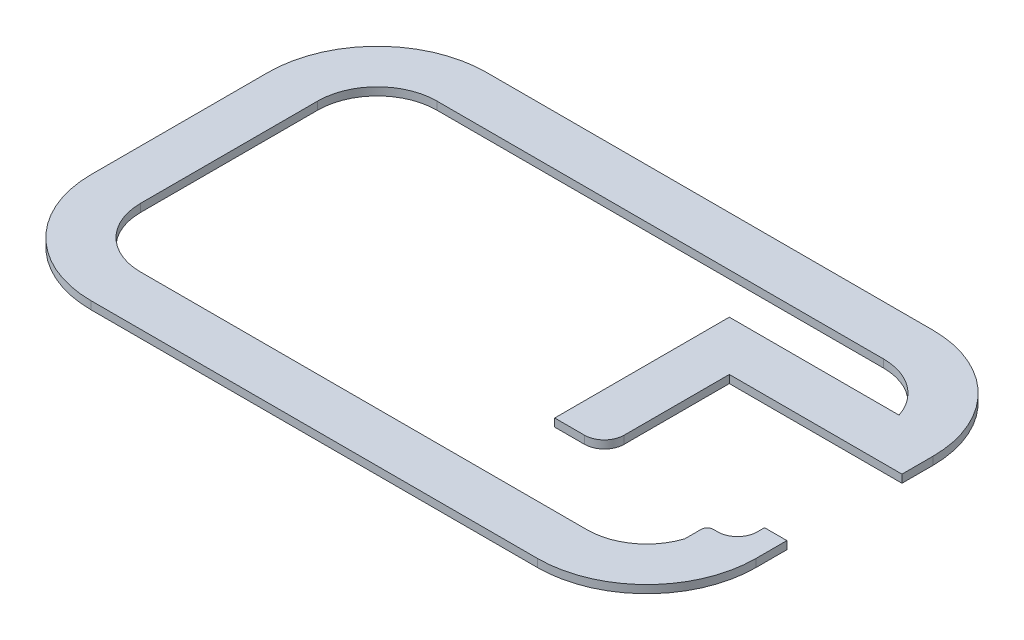
ISO-10303-21;
HEADER;
FILE_DESCRIPTION(('STEP AP214'),'2;1');
FILE_NAME('part.step','',(''),(''),'','','');
FILE_SCHEMA(('AUTOMOTIVE_DESIGN { 1 0 10303 214 1 1 1 1 }'));
ENDSEC;
DATA;
#1=APPLICATION_CONTEXT('core data for automotive mechanical design processes');
#2=APPLICATION_PROTOCOL_DEFINITION('international standard','automotive_design',2000,#1);
#3=PRODUCT_CONTEXT('',#1,'mechanical');
#4=PRODUCT('Part','Part','',(#3));
#5=PRODUCT_RELATED_PRODUCT_CATEGORY('part','',(#4));
#6=PRODUCT_DEFINITION_FORMATION('','',#4);
#7=PRODUCT_DEFINITION_CONTEXT('part definition',#1,'design');
#8=PRODUCT_DEFINITION('design','',#6,#7);
#9=PRODUCT_DEFINITION_SHAPE('','',#8);
#10=(LENGTH_UNIT() NAMED_UNIT(*) SI_UNIT(.MILLI.,.METRE.));
#11=(NAMED_UNIT(*) PLANE_ANGLE_UNIT() SI_UNIT($,.RADIAN.));
#12=(NAMED_UNIT(*) SI_UNIT($,.STERADIAN.) SOLID_ANGLE_UNIT());
#13=UNCERTAINTY_MEASURE_WITH_UNIT(LENGTH_MEASURE(1.E-05),#10,'distance_accuracy_value','');
#14=(GEOMETRIC_REPRESENTATION_CONTEXT(3) GLOBAL_UNCERTAINTY_ASSIGNED_CONTEXT((#13)) GLOBAL_UNIT_ASSIGNED_CONTEXT((#10,
#11,#12)) REPRESENTATION_CONTEXT('',''));
#15=CARTESIAN_POINT('',(0.,0.,0.));
#16=DIRECTION('',(0.,0.,1.));
#17=DIRECTION('',(1.,0.,0.));
#18=AXIS2_PLACEMENT_3D('',#15,#16,#17);
#19=CARTESIAN_POINT('',(5.26569899803327,4.,26.8294641926129));
#20=DIRECTION('',(0.,-1.,0.));
#21=DIRECTION('',(0.,0.,-1.));
#22=AXIS2_PLACEMENT_3D('',#19,#20,#21);
#23=CYLINDRICAL_SURFACE('',#22,55.);
#24=CARTESIAN_POINT('',(5.26569899803327,0.,26.8294641926129));
#25=DIRECTION('',(0.,1.,0.));
#26=DIRECTION('',(0.,0.,1.));
#27=AXIS2_PLACEMENT_3D('',#24,#25,#26);
#28=CIRCLE('',#27,55.);
#29=CARTESIAN_POINT('',(5.26569899803365,0.,-28.1705358073871));
#30=VERTEX_POINT('',#29);
#31=CARTESIAN_POINT('',(-49.7343010019667,0.,26.8294641926133));
#32=VERTEX_POINT('',#31);
#33=EDGE_CURVE('E248',#30,#32,#28,.T.);
#34=ORIENTED_EDGE('',*,*,#33,.T.);
#35=DIRECTION('',(0.,-1.,0.));
#36=VECTOR('',#35,1.);
#37=CARTESIAN_POINT('',(-49.7343010019667,4.,26.8294641926133));
#38=LINE('',#37,#36);
#39=CARTESIAN_POINT('',(-49.7343010019667,4.,26.8294641926133));
#40=VERTEX_POINT('',#39);
#41=EDGE_CURVE('E11',#40,#32,#38,.T.);
#42=ORIENTED_EDGE('',*,*,#41,.F.);
#43=CARTESIAN_POINT('',(5.26569899803327,4.,26.8294641926129));
#44=DIRECTION('',(0.,1.,0.));
#45=DIRECTION('',(0.,0.,1.));
#46=AXIS2_PLACEMENT_3D('',#43,#44,#45);
#47=CIRCLE('',#46,55.);
#48=CARTESIAN_POINT('',(5.26569899803365,4.,-28.1705358073871));
#49=VERTEX_POINT('',#48);
#50=EDGE_CURVE('E302',#49,#40,#47,.T.);
#51=ORIENTED_EDGE('',*,*,#50,.F.);
#52=DIRECTION('',(0.,-1.,0.));
#53=VECTOR('',#52,1.);
#54=CARTESIAN_POINT('',(5.26569899803365,4.,-28.1705358073871));
#55=LINE('',#54,#53);
#56=EDGE_CURVE('E244',#49,#30,#55,.T.);
#57=ORIENTED_EDGE('',*,*,#56,.T.);
#58=EDGE_LOOP('',(#34,#42,#51,#57));
#59=FACE_BOUND('',#58,.T.);
#60=ADVANCED_FACE('F32',(#59),#23,.T.);
#61=CARTESIAN_POINT('',(-49.7343010019667,4.,26.8294641926133));
#62=DIRECTION('',(1.,0.,0.));
#63=DIRECTION('',(0.,0.,-1.));
#64=AXIS2_PLACEMENT_3D('',#61,#62,#63);
#65=PLANE('',#64);
#66=DIRECTION('',(0.,0.,1.));
#67=VECTOR('',#66,1.);
#68=CARTESIAN_POINT('',(-49.7343010019667,0.,26.8294641926133));
#69=LINE('',#68,#67);
#70=CARTESIAN_POINT('',(-49.7343010019667,0.,116.089464192613));
#71=VERTEX_POINT('',#70);
#72=EDGE_CURVE('E251',#32,#71,#69,.T.);
#73=ORIENTED_EDGE('',*,*,#72,.T.);
#74=DIRECTION('',(0.,-1.,0.));
#75=VECTOR('',#74,1.);
#76=CARTESIAN_POINT('',(-49.7343010019667,4.,116.089464192613));
#77=LINE('',#76,#75);
#78=CARTESIAN_POINT('',(-49.7343010019667,4.,116.089464192613));
#79=VERTEX_POINT('',#78);
#80=EDGE_CURVE('E40',#79,#71,#77,.T.);
#81=ORIENTED_EDGE('',*,*,#80,.F.);
#82=DIRECTION('',(0.,0.,1.));
#83=VECTOR('',#82,1.);
#84=CARTESIAN_POINT('',(-49.7343010019667,4.,26.8294641926133));
#85=LINE('',#84,#83);
#86=EDGE_CURVE('E151',#40,#79,#85,.T.);
#87=ORIENTED_EDGE('',*,*,#86,.F.);
#88=ORIENTED_EDGE('',*,*,#41,.T.);
#89=EDGE_LOOP('',(#73,#81,#87,#88));
#90=FACE_BOUND('',#89,.T.);
#91=ADVANCED_FACE('F460',(#90),#65,.F.);
#92=CARTESIAN_POINT('',(5.26569899803329,4.,116.089464192613));
#93=DIRECTION('',(0.,-1.,0.));
#94=DIRECTION('',(0.,0.,-1.));
#95=AXIS2_PLACEMENT_3D('',#92,#93,#94);
#96=CYLINDRICAL_SURFACE('',#95,55.);
#97=CARTESIAN_POINT('',(5.26569899803329,0.,116.089464192613));
#98=DIRECTION('',(0.,1.,0.));
#99=DIRECTION('',(0.,0.,1.));
#100=AXIS2_PLACEMENT_3D('',#97,#98,#99);
#101=CIRCLE('',#100,55.);
#102=CARTESIAN_POINT('',(5.26569899803368,0.,171.089464192613));
#103=VERTEX_POINT('',#102);
#104=EDGE_CURVE('E253',#71,#103,#101,.T.);
#105=ORIENTED_EDGE('',*,*,#104,.T.);
#106=DIRECTION('',(0.,-1.,0.));
#107=VECTOR('',#106,1.);
#108=CARTESIAN_POINT('',(5.26569899803368,4.,171.089464192613));
#109=LINE('',#108,#107);
#110=CARTESIAN_POINT('',(5.26569899803368,4.,171.089464192613));
#111=VERTEX_POINT('',#110);
#112=EDGE_CURVE('E369',#111,#103,#109,.T.);
#113=ORIENTED_EDGE('',*,*,#112,.F.);
#114=CARTESIAN_POINT('',(5.26569899803329,4.,116.089464192613));
#115=DIRECTION('',(0.,1.,0.));
#116=DIRECTION('',(0.,0.,1.));
#117=AXIS2_PLACEMENT_3D('',#114,#115,#116);
#118=CIRCLE('',#117,55.);
#119=EDGE_CURVE('E377',#79,#111,#118,.T.);
#120=ORIENTED_EDGE('',*,*,#119,.F.);
#121=ORIENTED_EDGE('',*,*,#80,.T.);
#122=EDGE_LOOP('',(#105,#113,#120,#121));
#123=FACE_BOUND('',#122,.T.);
#124=ADVANCED_FACE('F375',(#123),#96,.T.);
#125=CARTESIAN_POINT('',(5.26569899803368,4.,171.089464192613));
#126=DIRECTION('',(0.,0.,-1.));
#127=DIRECTION('',(-1.,0.,0.));
#128=AXIS2_PLACEMENT_3D('',#125,#126,#127);
#129=PLANE('',#128);
#130=DIRECTION('',(1.,0.,0.));
#131=VECTOR('',#130,1.);
#132=CARTESIAN_POINT('',(5.26569899803368,0.,171.089464192613));
#133=LINE('',#132,#131);
#134=CARTESIAN_POINT('',(230.295698998033,0.,171.089464192613));
#135=VERTEX_POINT('',#134);
#136=EDGE_CURVE('E255',#103,#135,#133,.T.);
#137=ORIENTED_EDGE('',*,*,#136,.T.);
#138=DIRECTION('',(0.,-1.,0.));
#139=VECTOR('',#138,1.);
#140=CARTESIAN_POINT('',(230.295698998033,4.,171.089464192613));
#141=LINE('',#140,#139);
#142=CARTESIAN_POINT('',(230.295698998033,4.,171.089464192613));
#143=VERTEX_POINT('',#142);
#144=EDGE_CURVE('E366',#143,#135,#141,.T.);
#145=ORIENTED_EDGE('',*,*,#144,.F.);
#146=DIRECTION('',(1.,0.,0.));
#147=VECTOR('',#146,1.);
#148=CARTESIAN_POINT('',(5.26569899803368,4.,171.089464192613));
#149=LINE('',#148,#147);
#150=EDGE_CURVE('E395',#111,#143,#149,.T.);
#151=ORIENTED_EDGE('',*,*,#150,.F.);
#152=ORIENTED_EDGE('',*,*,#112,.T.);
#153=EDGE_LOOP('',(#137,#145,#151,#152));
#154=FACE_BOUND('',#153,.T.);
#155=ADVANCED_FACE('F386',(#154),#129,.F.);
#156=CARTESIAN_POINT('',(230.295698998033,4.,116.089464192613));
#157=DIRECTION('',(0.,-1.,0.));
#158=DIRECTION('',(0.,0.,-1.));
#159=AXIS2_PLACEMENT_3D('',#156,#157,#158);
#160=CYLINDRICAL_SURFACE('',#159,55.);
#161=CARTESIAN_POINT('',(230.295698998033,0.,116.089464192613));
#162=DIRECTION('',(0.,1.,0.));
#163=DIRECTION('',(0.,0.,1.));
#164=AXIS2_PLACEMENT_3D('',#161,#162,#163);
#165=CIRCLE('',#164,55.);
#166=CARTESIAN_POINT('',(285.295698998033,0.,116.089464192613));
#167=VERTEX_POINT('',#166);
#168=EDGE_CURVE('E257',#135,#167,#165,.T.);
#169=ORIENTED_EDGE('',*,*,#168,.T.);
#170=DIRECTION('',(0.,-1.,0.));
#171=VECTOR('',#170,1.);
#172=CARTESIAN_POINT('',(285.295698998033,4.,116.089464192613));
#173=LINE('',#172,#171);
#174=CARTESIAN_POINT('',(285.295698998033,4.,116.089464192613));
#175=VERTEX_POINT('',#174);
#176=EDGE_CURVE('E363',#175,#167,#173,.T.);
#177=ORIENTED_EDGE('',*,*,#176,.F.);
#178=CARTESIAN_POINT('',(230.295698998033,4.,116.089464192613));
#179=DIRECTION('',(0.,1.,0.));
#180=DIRECTION('',(0.,0.,1.));
#181=AXIS2_PLACEMENT_3D('',#178,#179,#180);
#182=CIRCLE('',#181,55.);
#183=EDGE_CURVE('E392',#143,#175,#182,.T.);
#184=ORIENTED_EDGE('',*,*,#183,.F.);
#185=ORIENTED_EDGE('',*,*,#144,.T.);
#186=EDGE_LOOP('',(#169,#177,#184,#185));
#187=FACE_BOUND('',#186,.T.);
#188=ADVANCED_FACE('F390',(#187),#160,.T.);
#189=CARTESIAN_POINT('',(285.295698998033,4.,100.459464192613));
#190=DIRECTION('',(-1.,0.,0.));
#191=DIRECTION('',(0.,0.,1.));
#192=AXIS2_PLACEMENT_3D('',#189,#190,#191);
#193=PLANE('',#192);
#194=DIRECTION('',(0.,0.,-1.));
#195=VECTOR('',#194,1.);
#196=CARTESIAN_POINT('',(285.295698998033,0.,100.459464192613));
#197=LINE('',#196,#195);
#198=CARTESIAN_POINT('',(285.295698998033,0.,100.459464192613));
#199=VERTEX_POINT('',#198);
#200=EDGE_CURVE('E259',#167,#199,#197,.T.);
#201=ORIENTED_EDGE('',*,*,#200,.T.);
#202=DIRECTION('',(0.,-1.,0.));
#203=VECTOR('',#202,1.);
#204=CARTESIAN_POINT('',(285.295698998033,4.,100.459464192613));
#205=LINE('',#204,#203);
#206=CARTESIAN_POINT('',(285.295698998033,4.,100.459464192613));
#207=VERTEX_POINT('',#206);
#208=EDGE_CURVE('E360',#207,#199,#205,.T.);
#209=ORIENTED_EDGE('',*,*,#208,.F.);
#210=DIRECTION('',(0.,0.,-1.));
#211=VECTOR('',#210,1.);
#212=CARTESIAN_POINT('',(285.295698998033,4.,100.459464192613));
#213=LINE('',#212,#211);
#214=EDGE_CURVE('E394',#175,#207,#213,.T.);
#215=ORIENTED_EDGE('',*,*,#214,.F.);
#216=ORIENTED_EDGE('',*,*,#176,.T.);
#217=EDGE_LOOP('',(#201,#209,#215,#216));
#218=FACE_BOUND('',#217,.T.);
#219=ADVANCED_FACE('F473',(#218),#193,.F.);
#220=CARTESIAN_POINT('',(274.045287588586,4.,100.459464192613));
#221=DIRECTION('',(0.,0.,1.));
#222=DIRECTION('',(1.,0.,0.));
#223=AXIS2_PLACEMENT_3D('',#220,#221,#222);
#224=PLANE('',#223);
#225=DIRECTION('',(-1.,0.,0.));
#226=VECTOR('',#225,1.);
#227=CARTESIAN_POINT('',(274.045287588586,0.,100.459464192613));
#228=LINE('',#227,#226);
#229=CARTESIAN_POINT('',(274.045287588586,0.,100.459464192613));
#230=VERTEX_POINT('',#229);
#231=EDGE_CURVE('E261',#199,#230,#228,.T.);
#232=ORIENTED_EDGE('',*,*,#231,.T.);
#233=DIRECTION('',(0.,-1.,0.));
#234=VECTOR('',#233,1.);
#235=CARTESIAN_POINT('',(274.045287588586,4.,100.459464192613));
#236=LINE('',#235,#234);
#237=CARTESIAN_POINT('',(274.045287588586,4.,100.459464192613));
#238=VERTEX_POINT('',#237);
#239=EDGE_CURVE('E357',#238,#230,#236,.T.);
#240=ORIENTED_EDGE('',*,*,#239,.F.);
#241=DIRECTION('',(-1.,0.,0.));
#242=VECTOR('',#241,1.);
#243=CARTESIAN_POINT('',(274.045287588586,4.,100.459464192613));
#244=LINE('',#243,#242);
#245=EDGE_CURVE('E397',#207,#238,#244,.T.);
#246=ORIENTED_EDGE('',*,*,#245,.F.);
#247=ORIENTED_EDGE('',*,*,#208,.T.);
#248=EDGE_LOOP('',(#232,#240,#246,#247));
#249=FACE_BOUND('',#248,.T.);
#250=ADVANCED_FACE('F476',(#249),#224,.F.);
#251=CARTESIAN_POINT('',(274.045287588586,4.,100.459464192613));
#252=DIRECTION('',(1.,0.,0.));
#253=DIRECTION('',(0.,0.,-1.));
#254=AXIS2_PLACEMENT_3D('',#251,#252,#253);
#255=PLANE('',#254);
#256=DIRECTION('',(0.,0.,1.));
#257=VECTOR('',#256,1.);
#258=CARTESIAN_POINT('',(274.045287588586,0.,100.459464192613));
#259=LINE('',#258,#257);
#260=CARTESIAN_POINT('',(274.045287588586,0.,104.089464192613));
#261=VERTEX_POINT('',#260);
#262=EDGE_CURVE('E263',#230,#261,#259,.T.);
#263=ORIENTED_EDGE('',*,*,#262,.T.);
#264=DIRECTION('',(0.,-1.,0.));
#265=VECTOR('',#264,1.);
#266=CARTESIAN_POINT('',(274.045287588586,4.,104.089464192613));
#267=LINE('',#266,#265);
#268=CARTESIAN_POINT('',(274.045287588586,4.,104.089464192613));
#269=VERTEX_POINT('',#268);
#270=EDGE_CURVE('E354',#269,#261,#267,.T.);
#271=ORIENTED_EDGE('',*,*,#270,.F.);
#272=DIRECTION('',(0.,0.,1.));
#273=VECTOR('',#272,1.);
#274=CARTESIAN_POINT('',(274.045287588586,4.,100.459464192613));
#275=LINE('',#274,#273);
#276=EDGE_CURVE('E403',#238,#269,#275,.T.);
#277=ORIENTED_EDGE('',*,*,#276,.F.);
#278=ORIENTED_EDGE('',*,*,#239,.T.);
#279=EDGE_LOOP('',(#263,#271,#277,#278));
#280=FACE_BOUND('',#279,.T.);
#281=ADVANCED_FACE('F480',(#280),#255,.F.);
#282=CARTESIAN_POINT('',(264.045287588586,4.,104.089464192613));
#283=DIRECTION('',(0.,-1.,0.));
#284=DIRECTION('',(0.,0.,-1.));
#285=AXIS2_PLACEMENT_3D('',#282,#283,#284);
#286=CYLINDRICAL_SURFACE('',#285,10.);
#287=CARTESIAN_POINT('',(264.045287588586,0.,104.089464192613));
#288=DIRECTION('',(0.,-1.,0.));
#289=DIRECTION('',(0.,0.,-1.));
#290=AXIS2_PLACEMENT_3D('',#287,#288,#289);
#291=CIRCLE('',#290,10.);
#292=CARTESIAN_POINT('',(264.045287588586,0.,114.089464192613));
#293=VERTEX_POINT('',#292);
#294=EDGE_CURVE('E265',#261,#293,#291,.T.);
#295=ORIENTED_EDGE('',*,*,#294,.T.);
#296=DIRECTION('',(0.,-1.,0.));
#297=VECTOR('',#296,1.);
#298=CARTESIAN_POINT('',(264.045287588586,4.,114.089464192613));
#299=LINE('',#298,#297);
#300=CARTESIAN_POINT('',(264.045287588586,4.,114.089464192613));
#301=VERTEX_POINT('',#300);
#302=EDGE_CURVE('E351',#301,#293,#299,.T.);
#303=ORIENTED_EDGE('',*,*,#302,.F.);
#304=CARTESIAN_POINT('',(264.045287588586,4.,104.089464192613));
#305=DIRECTION('',(0.,-1.,0.));
#306=DIRECTION('',(0.,0.,-1.));
#307=AXIS2_PLACEMENT_3D('',#304,#305,#306);
#308=CIRCLE('',#307,10.);
#309=EDGE_CURVE('E405',#269,#301,#308,.T.);
#310=ORIENTED_EDGE('',*,*,#309,.F.);
#311=ORIENTED_EDGE('',*,*,#270,.T.);
#312=EDGE_LOOP('',(#295,#303,#310,#311));
#313=FACE_BOUND('',#312,.T.);
#314=ADVANCED_FACE('F484',(#313),#286,.F.);
#315=CARTESIAN_POINT('',(264.045287588586,4.,114.089464192613));
#316=DIRECTION('',(0.,0.,1.));
#317=DIRECTION('',(1.,0.,0.));
#318=AXIS2_PLACEMENT_3D('',#315,#316,#317);
#319=PLANE('',#318);
#320=DIRECTION('',(-1.,0.,0.));
#321=VECTOR('',#320,1.);
#322=CARTESIAN_POINT('',(264.045287588586,0.,114.089464192613));
#323=LINE('',#322,#321);
#324=CARTESIAN_POINT('',(261.794876179138,0.,114.089464192613));
#325=VERTEX_POINT('',#324);
#326=EDGE_CURVE('E267',#293,#325,#323,.T.);
#327=ORIENTED_EDGE('',*,*,#326,.T.);
#328=DIRECTION('',(0.,-1.,0.));
#329=VECTOR('',#328,1.);
#330=CARTESIAN_POINT('',(261.794876179138,4.,114.089464192613));
#331=LINE('',#330,#329);
#332=CARTESIAN_POINT('',(261.794876179138,4.,114.089464192613));
#333=VERTEX_POINT('',#332);
#334=EDGE_CURVE('E348',#333,#325,#331,.T.);
#335=ORIENTED_EDGE('',*,*,#334,.F.);
#336=DIRECTION('',(-1.,0.,0.));
#337=VECTOR('',#336,1.);
#338=CARTESIAN_POINT('',(264.045287588586,4.,114.089464192613));
#339=LINE('',#338,#337);
#340=EDGE_CURVE('E407',#301,#333,#339,.T.);
#341=ORIENTED_EDGE('',*,*,#340,.F.);
#342=ORIENTED_EDGE('',*,*,#302,.T.);
#343=EDGE_LOOP('',(#327,#335,#341,#342));
#344=FACE_BOUND('',#343,.T.);
#345=ADVANCED_FACE('F488',(#344),#319,.F.);
#346=CARTESIAN_POINT('',(261.794876179138,4.,117.089464192613));
#347=DIRECTION('',(0.,-1.,0.));
#348=DIRECTION('',(0.,0.,-1.));
#349=AXIS2_PLACEMENT_3D('',#346,#347,#348);
#350=CYLINDRICAL_SURFACE('',#349,3.);
#351=CARTESIAN_POINT('',(261.794876179138,0.,117.089464192613));
#352=DIRECTION('',(0.,1.,0.));
#353=DIRECTION('',(0.,0.,1.));
#354=AXIS2_PLACEMENT_3D('',#351,#352,#353);
#355=CIRCLE('',#354,3.);
#356=CARTESIAN_POINT('',(258.794876179138,0.,117.089464192613));
#357=VERTEX_POINT('',#356);
#358=EDGE_CURVE('E269',#325,#357,#355,.T.);
#359=ORIENTED_EDGE('',*,*,#358,.T.);
#360=DIRECTION('',(0.,-1.,0.));
#361=VECTOR('',#360,1.);
#362=CARTESIAN_POINT('',(258.794876179138,4.,117.089464192613));
#363=LINE('',#362,#361);
#364=CARTESIAN_POINT('',(258.794876179138,4.,117.089464192613));
#365=VERTEX_POINT('',#364);
#366=EDGE_CURVE('E345',#365,#357,#363,.T.);
#367=ORIENTED_EDGE('',*,*,#366,.F.);
#368=CARTESIAN_POINT('',(261.794876179138,4.,117.089464192613));
#369=DIRECTION('',(0.,1.,0.));
#370=DIRECTION('',(0.,0.,1.));
#371=AXIS2_PLACEMENT_3D('',#368,#369,#370);
#372=CIRCLE('',#371,3.);
#373=EDGE_CURVE('E409',#333,#365,#372,.T.);
#374=ORIENTED_EDGE('',*,*,#373,.F.);
#375=ORIENTED_EDGE('',*,*,#334,.T.);
#376=EDGE_LOOP('',(#359,#367,#374,#375));
#377=FACE_BOUND('',#376,.T.);
#378=ADVANCED_FACE('F492',(#377),#350,.T.);
#379=CARTESIAN_POINT('',(258.794876179138,4.,125.459464192613));
#380=DIRECTION('',(1.,0.,0.));
#381=DIRECTION('',(0.,0.,-1.));
#382=AXIS2_PLACEMENT_3D('',#379,#380,#381);
#383=PLANE('',#382);
#384=DIRECTION('',(0.,0.,1.));
#385=VECTOR('',#384,1.);
#386=CARTESIAN_POINT('',(258.794876179138,0.,125.459464192613));
#387=LINE('',#386,#385);
#388=CARTESIAN_POINT('',(258.794876179138,0.,125.459464192613));
#389=VERTEX_POINT('',#388);
#390=EDGE_CURVE('E271',#357,#389,#387,.T.);
#391=ORIENTED_EDGE('',*,*,#390,.T.);
#392=DIRECTION('',(0.,-1.,0.));
#393=VECTOR('',#392,1.);
#394=CARTESIAN_POINT('',(258.794876179138,4.,125.459464192613));
#395=LINE('',#394,#393);
#396=CARTESIAN_POINT('',(258.794876179138,4.,125.459464192613));
#397=VERTEX_POINT('',#396);
#398=EDGE_CURVE('E342',#397,#389,#395,.T.);
#399=ORIENTED_EDGE('',*,*,#398,.F.);
#400=DIRECTION('',(0.,0.,1.));
#401=VECTOR('',#400,1.);
#402=CARTESIAN_POINT('',(258.794876179138,4.,125.459464192613));
#403=LINE('',#402,#401);
#404=EDGE_CURVE('E411',#365,#397,#403,.T.);
#405=ORIENTED_EDGE('',*,*,#404,.F.);
#406=ORIENTED_EDGE('',*,*,#366,.T.);
#407=EDGE_LOOP('',(#391,#399,#405,#406));
#408=FACE_BOUND('',#407,.T.);
#409=ADVANCED_FACE('F496',(#408),#383,.F.);
#410=CARTESIAN_POINT('',(230.295698998033,4.,116.089464192613));
#411=DIRECTION('',(0.,-1.,0.));
#412=DIRECTION('',(0.,0.,-1.));
#413=AXIS2_PLACEMENT_3D('',#410,#411,#412);
#414=CYLINDRICAL_SURFACE('',#413,30.);
#415=CARTESIAN_POINT('',(230.295698998033,0.,116.089464192613));
#416=DIRECTION('',(0.,-1.,0.));
#417=DIRECTION('',(0.,0.,1.));
#418=AXIS2_PLACEMENT_3D('',#415,#416,#417);
#419=CIRCLE('',#418,30.);
#420=CARTESIAN_POINT('',(230.295698998033,0.,146.089464192613));
#421=VERTEX_POINT('',#420);
#422=EDGE_CURVE('E273',#389,#421,#419,.T.);
#423=ORIENTED_EDGE('',*,*,#422,.T.);
#424=DIRECTION('',(0.,-1.,0.));
#425=VECTOR('',#424,1.);
#426=CARTESIAN_POINT('',(230.295698998033,4.,146.089464192613));
#427=LINE('',#426,#425);
#428=CARTESIAN_POINT('',(230.295698998033,4.,146.089464192613));
#429=VERTEX_POINT('',#428);
#430=EDGE_CURVE('E339',#429,#421,#427,.T.);
#431=ORIENTED_EDGE('',*,*,#430,.F.);
#432=CARTESIAN_POINT('',(230.295698998033,4.,116.089464192613));
#433=DIRECTION('',(0.,-1.,0.));
#434=DIRECTION('',(0.,0.,1.));
#435=AXIS2_PLACEMENT_3D('',#432,#433,#434);
#436=CIRCLE('',#435,30.);
#437=EDGE_CURVE('E413',#397,#429,#436,.T.);
#438=ORIENTED_EDGE('',*,*,#437,.F.);
#439=ORIENTED_EDGE('',*,*,#398,.T.);
#440=EDGE_LOOP('',(#423,#431,#438,#439));
#441=FACE_BOUND('',#440,.T.);
#442=ADVANCED_FACE('F500',(#441),#414,.F.);
#443=CARTESIAN_POINT('',(5.26569899803368,4.,146.089464192613));
#444=DIRECTION('',(0.,0.,1.));
#445=DIRECTION('',(1.,0.,0.));
#446=AXIS2_PLACEMENT_3D('',#443,#444,#445);
#447=PLANE('',#446);
#448=DIRECTION('',(-1.,0.,0.));
#449=VECTOR('',#448,1.);
#450=CARTESIAN_POINT('',(5.26569899803368,0.,146.089464192613));
#451=LINE('',#450,#449);
#452=CARTESIAN_POINT('',(5.26569899803369,0.,146.089464192613));
#453=VERTEX_POINT('',#452);
#454=EDGE_CURVE('E275',#421,#453,#451,.T.);
#455=ORIENTED_EDGE('',*,*,#454,.T.);
#456=DIRECTION('',(0.,-1.,0.));
#457=VECTOR('',#456,1.);
#458=CARTESIAN_POINT('',(5.26569899803369,4.,146.089464192613));
#459=LINE('',#458,#457);
#460=CARTESIAN_POINT('',(5.26569899803369,4.,146.089464192613));
#461=VERTEX_POINT('',#460);
#462=EDGE_CURVE('E336',#461,#453,#459,.T.);
#463=ORIENTED_EDGE('',*,*,#462,.F.);
#464=DIRECTION('',(-1.,0.,0.));
#465=VECTOR('',#464,1.);
#466=CARTESIAN_POINT('',(5.26569899803368,4.,146.089464192613));
#467=LINE('',#466,#465);
#468=EDGE_CURVE('E415',#429,#461,#467,.T.);
#469=ORIENTED_EDGE('',*,*,#468,.F.);
#470=ORIENTED_EDGE('',*,*,#430,.T.);
#471=EDGE_LOOP('',(#455,#463,#469,#470));
#472=FACE_BOUND('',#471,.T.);
#473=ADVANCED_FACE('F504',(#472),#447,.F.);
#474=CARTESIAN_POINT('',(5.26569899803329,4.,116.089464192613));
#475=DIRECTION('',(0.,-1.,0.));
#476=DIRECTION('',(0.,0.,-1.));
#477=AXIS2_PLACEMENT_3D('',#474,#475,#476);
#478=CYLINDRICAL_SURFACE('',#477,30.);
#479=CARTESIAN_POINT('',(5.26569899803329,0.,116.089464192613));
#480=DIRECTION('',(0.,-1.,0.));
#481=DIRECTION('',(0.,0.,1.));
#482=AXIS2_PLACEMENT_3D('',#479,#480,#481);
#483=CIRCLE('',#482,30.);
#484=CARTESIAN_POINT('',(-24.7343010019667,0.,116.089464192613));
#485=VERTEX_POINT('',#484);
#486=EDGE_CURVE('E277',#453,#485,#483,.T.);
#487=ORIENTED_EDGE('',*,*,#486,.T.);
#488=DIRECTION('',(0.,-1.,0.));
#489=VECTOR('',#488,1.);
#490=CARTESIAN_POINT('',(-24.7343010019667,4.,116.089464192613));
#491=LINE('',#490,#489);
#492=CARTESIAN_POINT('',(-24.7343010019667,4.,116.089464192613));
#493=VERTEX_POINT('',#492);
#494=EDGE_CURVE('E333',#493,#485,#491,.T.);
#495=ORIENTED_EDGE('',*,*,#494,.F.);
#496=CARTESIAN_POINT('',(5.26569899803329,4.,116.089464192613));
#497=DIRECTION('',(0.,-1.,0.));
#498=DIRECTION('',(0.,0.,1.));
#499=AXIS2_PLACEMENT_3D('',#496,#497,#498);
#500=CIRCLE('',#499,30.);
#501=EDGE_CURVE('E417',#461,#493,#500,.T.);
#502=ORIENTED_EDGE('',*,*,#501,.F.);
#503=ORIENTED_EDGE('',*,*,#462,.T.);
#504=EDGE_LOOP('',(#487,#495,#502,#503));
#505=FACE_BOUND('',#504,.T.);
#506=ADVANCED_FACE('F508',(#505),#478,.F.);
#507=CARTESIAN_POINT('',(-24.7343010019667,4.,26.8294641926133));
#508=DIRECTION('',(-1.,0.,0.));
#509=DIRECTION('',(0.,0.,1.));
#510=AXIS2_PLACEMENT_3D('',#507,#508,#509);
#511=PLANE('',#510);
#512=DIRECTION('',(0.,0.,-1.));
#513=VECTOR('',#512,1.);
#514=CARTESIAN_POINT('',(-24.7343010019667,0.,26.8294641926133));
#515=LINE('',#514,#513);
#516=CARTESIAN_POINT('',(-24.7343010019667,0.,26.8294641926133));
#517=VERTEX_POINT('',#516);
#518=EDGE_CURVE('E279',#485,#517,#515,.T.);
#519=ORIENTED_EDGE('',*,*,#518,.T.);
#520=DIRECTION('',(0.,-1.,0.));
#521=VECTOR('',#520,1.);
#522=CARTESIAN_POINT('',(-24.7343010019667,4.,26.8294641926133));
#523=LINE('',#522,#521);
#524=CARTESIAN_POINT('',(-24.7343010019667,4.,26.8294641926133));
#525=VERTEX_POINT('',#524);
#526=EDGE_CURVE('E330',#525,#517,#523,.T.);
#527=ORIENTED_EDGE('',*,*,#526,.F.);
#528=DIRECTION('',(0.,0.,-1.));
#529=VECTOR('',#528,1.);
#530=CARTESIAN_POINT('',(-24.7343010019667,4.,26.8294641926133));
#531=LINE('',#530,#529);
#532=EDGE_CURVE('E419',#493,#525,#531,.T.);
#533=ORIENTED_EDGE('',*,*,#532,.F.);
#534=ORIENTED_EDGE('',*,*,#494,.T.);
#535=EDGE_LOOP('',(#519,#527,#533,#534));
#536=FACE_BOUND('',#535,.T.);
#537=ADVANCED_FACE('F512',(#536),#511,.F.);
#538=CARTESIAN_POINT('',(5.26569899803327,4.,26.8294641926129));
#539=DIRECTION('',(0.,-1.,0.));
#540=DIRECTION('',(0.,0.,-1.));
#541=AXIS2_PLACEMENT_3D('',#538,#539,#540);
#542=CYLINDRICAL_SURFACE('',#541,30.);
#543=CARTESIAN_POINT('',(5.26569899803327,0.,26.8294641926129));
#544=DIRECTION('',(0.,-1.,0.));
#545=DIRECTION('',(0.,0.,1.));
#546=AXIS2_PLACEMENT_3D('',#543,#544,#545);
#547=CIRCLE('',#546,30.);
#548=CARTESIAN_POINT('',(5.26569899803347,0.,-3.17053580738707));
#549=VERTEX_POINT('',#548);
#550=EDGE_CURVE('E281',#517,#549,#547,.T.);
#551=ORIENTED_EDGE('',*,*,#550,.T.);
#552=DIRECTION('',(0.,-1.,0.));
#553=VECTOR('',#552,1.);
#554=CARTESIAN_POINT('',(5.26569899803347,4.,-3.17053580738707));
#555=LINE('',#554,#553);
#556=CARTESIAN_POINT('',(5.26569899803347,4.,-3.17053580738707));
#557=VERTEX_POINT('',#556);
#558=EDGE_CURVE('E327',#557,#549,#555,.T.);
#559=ORIENTED_EDGE('',*,*,#558,.F.);
#560=CARTESIAN_POINT('',(5.26569899803327,4.,26.8294641926129));
#561=DIRECTION('',(0.,-1.,0.));
#562=DIRECTION('',(0.,0.,1.));
#563=AXIS2_PLACEMENT_3D('',#560,#561,#562);
#564=CIRCLE('',#563,30.);
#565=EDGE_CURVE('E421',#525,#557,#564,.T.);
#566=ORIENTED_EDGE('',*,*,#565,.F.);
#567=ORIENTED_EDGE('',*,*,#526,.T.);
#568=EDGE_LOOP('',(#551,#559,#566,#567));
#569=FACE_BOUND('',#568,.T.);
#570=ADVANCED_FACE('F516',(#569),#542,.F.);
#571=CARTESIAN_POINT('',(5.26569899803347,4.,-3.17053580738707));
#572=DIRECTION('',(0.,0.,-1.));
#573=DIRECTION('',(-1.,0.,0.));
#574=AXIS2_PLACEMENT_3D('',#571,#572,#573);
#575=PLANE('',#574);
#576=DIRECTION('',(1.,0.,0.));
#577=VECTOR('',#576,1.);
#578=CARTESIAN_POINT('',(5.26569899803347,0.,-3.17053580738707));
#579=LINE('',#578,#577);
#580=CARTESIAN_POINT('',(230.295698998033,0.,-3.17053580738707));
#581=VERTEX_POINT('',#580);
#582=EDGE_CURVE('E283',#549,#581,#579,.T.);
#583=ORIENTED_EDGE('',*,*,#582,.T.);
#584=DIRECTION('',(0.,-1.,0.));
#585=VECTOR('',#584,1.);
#586=CARTESIAN_POINT('',(230.295698998033,4.,-3.17053580738707));
#587=LINE('',#586,#585);
#588=CARTESIAN_POINT('',(230.295698998033,4.,-3.17053580738707));
#589=VERTEX_POINT('',#588);
#590=EDGE_CURVE('E324',#589,#581,#587,.T.);
#591=ORIENTED_EDGE('',*,*,#590,.F.);
#592=DIRECTION('',(1.,0.,0.));
#593=VECTOR('',#592,1.);
#594=CARTESIAN_POINT('',(5.26569899803347,4.,-3.17053580738707));
#595=LINE('',#594,#593);
#596=EDGE_CURVE('E423',#557,#589,#595,.T.);
#597=ORIENTED_EDGE('',*,*,#596,.F.);
#598=ORIENTED_EDGE('',*,*,#558,.T.);
#599=EDGE_LOOP('',(#583,#591,#597,#598));
#600=FACE_BOUND('',#599,.T.);
#601=ADVANCED_FACE('F520',(#600),#575,.F.);
#602=CARTESIAN_POINT('',(230.295698998033,4.,26.8294641926129));
#603=DIRECTION('',(0.,-1.,0.));
#604=DIRECTION('',(0.,0.,-1.));
#605=AXIS2_PLACEMENT_3D('',#602,#603,#604);
#606=CYLINDRICAL_SURFACE('',#605,30.);
#607=CARTESIAN_POINT('',(230.295698998033,0.,26.8294641926129));
#608=DIRECTION('',(0.,-1.,0.));
#609=DIRECTION('',(0.,0.,-1.));
#610=AXIS2_PLACEMENT_3D('',#607,#608,#609);
#611=CIRCLE('',#610,30.);
#612=CARTESIAN_POINT('',(258.794876179138,0.,17.459464192613));
#613=VERTEX_POINT('',#612);
#614=EDGE_CURVE('E285',#581,#613,#611,.T.);
#615=ORIENTED_EDGE('',*,*,#614,.T.);
#616=DIRECTION('',(0.,-1.,0.));
#617=VECTOR('',#616,1.);
#618=CARTESIAN_POINT('',(258.794876179138,4.,17.459464192613));
#619=LINE('',#618,#617);
#620=CARTESIAN_POINT('',(258.794876179138,4.,17.459464192613));
#621=VERTEX_POINT('',#620);
#622=EDGE_CURVE('E321',#621,#613,#619,.T.);
#623=ORIENTED_EDGE('',*,*,#622,.F.);
#624=CARTESIAN_POINT('',(230.295698998033,4.,26.8294641926129));
#625=DIRECTION('',(0.,-1.,0.));
#626=DIRECTION('',(0.,0.,-1.));
#627=AXIS2_PLACEMENT_3D('',#624,#625,#626);
#628=CIRCLE('',#627,30.);
#629=EDGE_CURVE('E425',#589,#621,#628,.T.);
#630=ORIENTED_EDGE('',*,*,#629,.F.);
#631=ORIENTED_EDGE('',*,*,#590,.T.);
#632=EDGE_LOOP('',(#615,#623,#630,#631));
#633=FACE_BOUND('',#632,.T.);
#634=ADVANCED_FACE('F524',(#633),#606,.F.);
#635=CARTESIAN_POINT('',(173.295698998033,4.,17.459464192613));
#636=DIRECTION('',(0.,0.,1.));
#637=DIRECTION('',(1.,0.,0.));
#638=AXIS2_PLACEMENT_3D('',#635,#636,#637);
#639=PLANE('',#638);
#640=DIRECTION('',(-1.,0.,0.));
#641=VECTOR('',#640,1.);
#642=CARTESIAN_POINT('',(173.295698998033,0.,17.459464192613));
#643=LINE('',#642,#641);
#644=CARTESIAN_POINT('',(173.295698998033,0.,17.459464192613));
#645=VERTEX_POINT('',#644);
#646=EDGE_CURVE('E287',#613,#645,#643,.T.);
#647=ORIENTED_EDGE('',*,*,#646,.T.);
#648=DIRECTION('',(0.,-1.,0.));
#649=VECTOR('',#648,1.);
#650=CARTESIAN_POINT('',(173.295698998033,4.,17.459464192613));
#651=LINE('',#650,#649);
#652=CARTESIAN_POINT('',(173.295698998033,4.,17.459464192613));
#653=VERTEX_POINT('',#652);
#654=EDGE_CURVE('E318',#653,#645,#651,.T.);
#655=ORIENTED_EDGE('',*,*,#654,.F.);
#656=DIRECTION('',(-1.,0.,0.));
#657=VECTOR('',#656,1.);
#658=CARTESIAN_POINT('',(173.295698998033,4.,17.459464192613));
#659=LINE('',#658,#657);
#660=EDGE_CURVE('E427',#621,#653,#659,.T.);
#661=ORIENTED_EDGE('',*,*,#660,.F.);
#662=ORIENTED_EDGE('',*,*,#622,.T.);
#663=EDGE_LOOP('',(#647,#655,#661,#662));
#664=FACE_BOUND('',#663,.T.);
#665=ADVANCED_FACE('F528',(#664),#639,.F.);
#666=CARTESIAN_POINT('',(173.295698998033,4.,17.459464192613));
#667=DIRECTION('',(1.,0.,0.));
#668=DIRECTION('',(0.,0.,-1.));
#669=AXIS2_PLACEMENT_3D('',#666,#667,#668);
#670=PLANE('',#669);
#671=DIRECTION('',(0.,0.,1.));
#672=VECTOR('',#671,1.);
#673=CARTESIAN_POINT('',(173.295698998033,0.,17.459464192613));
#674=LINE('',#673,#672);
#675=CARTESIAN_POINT('',(173.295698998033,0.,105.459464192613));
#676=VERTEX_POINT('',#675);
#677=EDGE_CURVE('E289',#645,#676,#674,.T.);
#678=ORIENTED_EDGE('',*,*,#677,.T.);
#679=DIRECTION('',(0.,-1.,0.));
#680=VECTOR('',#679,1.);
#681=CARTESIAN_POINT('',(173.295698998033,4.,105.459464192613));
#682=LINE('',#681,#680);
#683=CARTESIAN_POINT('',(173.295698998033,4.,105.459464192613));
#684=VERTEX_POINT('',#683);
#685=EDGE_CURVE('E315',#684,#676,#682,.T.);
#686=ORIENTED_EDGE('',*,*,#685,.F.);
#687=DIRECTION('',(0.,0.,1.));
#688=VECTOR('',#687,1.);
#689=CARTESIAN_POINT('',(173.295698998033,4.,17.459464192613));
#690=LINE('',#689,#688);
#691=EDGE_CURVE('E429',#653,#684,#690,.T.);
#692=ORIENTED_EDGE('',*,*,#691,.F.);
#693=ORIENTED_EDGE('',*,*,#654,.T.);
#694=EDGE_LOOP('',(#678,#686,#692,#693));
#695=FACE_BOUND('',#694,.T.);
#696=ADVANCED_FACE('F532',(#695),#670,.F.);
#697=CARTESIAN_POINT('',(173.295698998033,4.,105.459464192613));
#698=DIRECTION('',(0.,0.,-1.));
#699=DIRECTION('',(-1.,0.,0.));
#700=AXIS2_PLACEMENT_3D('',#697,#698,#699);
#701=PLANE('',#700);
#702=DIRECTION('',(1.,0.,0.));
#703=VECTOR('',#702,1.);
#704=CARTESIAN_POINT('',(173.295698998033,0.,105.459464192613));
#705=LINE('',#704,#703);
#706=CARTESIAN_POINT('',(188.295698998033,0.,105.459464192613));
#707=VERTEX_POINT('',#706);
#708=EDGE_CURVE('E291',#676,#707,#705,.T.);
#709=ORIENTED_EDGE('',*,*,#708,.T.);
#710=DIRECTION('',(0.,-1.,0.));
#711=VECTOR('',#710,1.);
#712=CARTESIAN_POINT('',(188.295698998033,4.,105.459464192613));
#713=LINE('',#712,#711);
#714=CARTESIAN_POINT('',(188.295698998033,4.,105.459464192613));
#715=VERTEX_POINT('',#714);
#716=EDGE_CURVE('E312',#715,#707,#713,.T.);
#717=ORIENTED_EDGE('',*,*,#716,.F.);
#718=DIRECTION('',(1.,0.,0.));
#719=VECTOR('',#718,1.);
#720=CARTESIAN_POINT('',(173.295698998033,4.,105.459464192613));
#721=LINE('',#720,#719);
#722=EDGE_CURVE('E431',#684,#715,#721,.T.);
#723=ORIENTED_EDGE('',*,*,#722,.F.);
#724=ORIENTED_EDGE('',*,*,#685,.T.);
#725=EDGE_LOOP('',(#709,#717,#723,#724));
#726=FACE_BOUND('',#725,.T.);
#727=ADVANCED_FACE('F536',(#726),#701,.F.);
#728=CARTESIAN_POINT('',(188.295698998033,4.,95.4594641926129));
#729=DIRECTION('',(0.,-1.,0.));
#730=DIRECTION('',(0.,0.,-1.));
#731=AXIS2_PLACEMENT_3D('',#728,#729,#730);
#732=CYLINDRICAL_SURFACE('',#731,10.);
#733=CARTESIAN_POINT('',(188.295698998033,0.,95.4594641926129));
#734=DIRECTION('',(0.,1.,0.));
#735=DIRECTION('',(0.,0.,-1.));
#736=AXIS2_PLACEMENT_3D('',#733,#734,#735);
#737=CIRCLE('',#736,10.);
#738=CARTESIAN_POINT('',(198.295698998033,0.,95.4594641926129));
#739=VERTEX_POINT('',#738);
#740=EDGE_CURVE('E293',#707,#739,#737,.T.);
#741=ORIENTED_EDGE('',*,*,#740,.T.);
#742=DIRECTION('',(0.,-1.,0.));
#743=VECTOR('',#742,1.);
#744=CARTESIAN_POINT('',(198.295698998033,4.,95.4594641926129));
#745=LINE('',#744,#743);
#746=CARTESIAN_POINT('',(198.295698998033,4.,95.4594641926129));
#747=VERTEX_POINT('',#746);
#748=EDGE_CURVE('E309',#747,#739,#745,.T.);
#749=ORIENTED_EDGE('',*,*,#748,.F.);
#750=CARTESIAN_POINT('',(188.295698998033,4.,95.4594641926129));
#751=DIRECTION('',(0.,1.,0.));
#752=DIRECTION('',(0.,0.,-1.));
#753=AXIS2_PLACEMENT_3D('',#750,#751,#752);
#754=CIRCLE('',#753,10.);
#755=EDGE_CURVE('E433',#715,#747,#754,.T.);
#756=ORIENTED_EDGE('',*,*,#755,.F.);
#757=ORIENTED_EDGE('',*,*,#716,.T.);
#758=EDGE_LOOP('',(#741,#749,#756,#757));
#759=FACE_BOUND('',#758,.T.);
#760=ADVANCED_FACE('F540',(#759),#732,.T.);
#761=CARTESIAN_POINT('',(198.295698998033,4.,42.459464192613));
#762=DIRECTION('',(-1.,0.,0.));
#763=DIRECTION('',(0.,0.,1.));
#764=AXIS2_PLACEMENT_3D('',#761,#762,#763);
#765=PLANE('',#764);
#766=DIRECTION('',(0.,0.,-1.));
#767=VECTOR('',#766,1.);
#768=CARTESIAN_POINT('',(198.295698998033,0.,42.459464192613));
#769=LINE('',#768,#767);
#770=CARTESIAN_POINT('',(198.295698998033,0.,42.459464192613));
#771=VERTEX_POINT('',#770);
#772=EDGE_CURVE('E295',#739,#771,#769,.T.);
#773=ORIENTED_EDGE('',*,*,#772,.T.);
#774=DIRECTION('',(0.,-1.,0.));
#775=VECTOR('',#774,1.);
#776=CARTESIAN_POINT('',(198.295698998033,4.,42.459464192613));
#777=LINE('',#776,#775);
#778=CARTESIAN_POINT('',(198.295698998033,4.,42.459464192613));
#779=VERTEX_POINT('',#778);
#780=EDGE_CURVE('E306',#779,#771,#777,.T.);
#781=ORIENTED_EDGE('',*,*,#780,.F.);
#782=DIRECTION('',(0.,0.,-1.));
#783=VECTOR('',#782,1.);
#784=CARTESIAN_POINT('',(198.295698998033,4.,42.459464192613));
#785=LINE('',#784,#783);
#786=EDGE_CURVE('E435',#747,#779,#785,.T.);
#787=ORIENTED_EDGE('',*,*,#786,.F.);
#788=ORIENTED_EDGE('',*,*,#748,.T.);
#789=EDGE_LOOP('',(#773,#781,#787,#788));
#790=FACE_BOUND('',#789,.T.);
#791=ADVANCED_FACE('F441',(#790),#765,.F.);
#792=CARTESIAN_POINT('',(198.295698998033,4.,42.459464192613));
#793=DIRECTION('',(0.,0.,-1.));
#794=DIRECTION('',(-1.,0.,0.));
#795=AXIS2_PLACEMENT_3D('',#792,#793,#794);
#796=PLANE('',#795);
#797=DIRECTION('',(1.,0.,0.));
#798=VECTOR('',#797,1.);
#799=CARTESIAN_POINT('',(198.295698998033,0.,42.459464192613));
#800=LINE('',#799,#798);
#801=CARTESIAN_POINT('',(285.295698998033,0.,42.459464192613));
#802=VERTEX_POINT('',#801);
#803=EDGE_CURVE('E297',#771,#802,#800,.T.);
#804=ORIENTED_EDGE('',*,*,#803,.T.);
#805=DIRECTION('',(0.,-1.,0.));
#806=VECTOR('',#805,1.);
#807=CARTESIAN_POINT('',(285.295698998033,4.,42.459464192613));
#808=LINE('',#807,#806);
#809=CARTESIAN_POINT('',(285.295698998033,4.,42.459464192613));
#810=VERTEX_POINT('',#809);
#811=EDGE_CURVE('E239',#810,#802,#808,.T.);
#812=ORIENTED_EDGE('',*,*,#811,.F.);
#813=DIRECTION('',(1.,0.,0.));
#814=VECTOR('',#813,1.);
#815=CARTESIAN_POINT('',(198.295698998033,4.,42.459464192613));
#816=LINE('',#815,#814);
#817=EDGE_CURVE('E230',#779,#810,#816,.T.);
#818=ORIENTED_EDGE('',*,*,#817,.F.);
#819=ORIENTED_EDGE('',*,*,#780,.T.);
#820=EDGE_LOOP('',(#804,#812,#818,#819));
#821=FACE_BOUND('',#820,.T.);
#822=ADVANCED_FACE('F445',(#821),#796,.F.);
#823=CARTESIAN_POINT('',(285.295698998033,4.,26.8294641926133));
#824=DIRECTION('',(-1.,0.,0.));
#825=DIRECTION('',(0.,0.,1.));
#826=AXIS2_PLACEMENT_3D('',#823,#824,#825);
#827=PLANE('',#826);
#828=DIRECTION('',(0.,0.,-1.));
#829=VECTOR('',#828,1.);
#830=CARTESIAN_POINT('',(285.295698998033,0.,26.8294641926133));
#831=LINE('',#830,#829);
#832=CARTESIAN_POINT('',(285.295698998033,0.,26.8294641926133));
#833=VERTEX_POINT('',#832);
#834=EDGE_CURVE('E238',#802,#833,#831,.T.);
#835=ORIENTED_EDGE('',*,*,#834,.T.);
#836=DIRECTION('',(0.,-1.,0.));
#837=VECTOR('',#836,1.);
#838=CARTESIAN_POINT('',(285.295698998033,4.,26.8294641926133));
#839=LINE('',#838,#837);
#840=CARTESIAN_POINT('',(285.295698998033,4.,26.8294641926133));
#841=VERTEX_POINT('',#840);
#842=EDGE_CURVE('E235',#841,#833,#839,.T.);
#843=ORIENTED_EDGE('',*,*,#842,.F.);
#844=DIRECTION('',(0.,0.,-1.));
#845=VECTOR('',#844,1.);
#846=CARTESIAN_POINT('',(285.295698998033,4.,26.8294641926133));
#847=LINE('',#846,#845);
#848=EDGE_CURVE('E224',#810,#841,#847,.T.);
#849=ORIENTED_EDGE('',*,*,#848,.F.);
#850=ORIENTED_EDGE('',*,*,#811,.T.);
#851=EDGE_LOOP('',(#835,#843,#849,#850));
#852=FACE_BOUND('',#851,.T.);
#853=ADVANCED_FACE('F236',(#852),#827,.F.);
#854=CARTESIAN_POINT('',(230.295698998033,4.,26.8294641926129));
#855=DIRECTION('',(0.,-1.,0.));
#856=DIRECTION('',(0.,0.,-1.));
#857=AXIS2_PLACEMENT_3D('',#854,#855,#856);
#858=CYLINDRICAL_SURFACE('',#857,55.);
#859=CARTESIAN_POINT('',(230.295698998033,0.,26.8294641926129));
#860=DIRECTION('',(0.,1.,0.));
#861=DIRECTION('',(0.,0.,-1.));
#862=AXIS2_PLACEMENT_3D('',#859,#860,#861);
#863=CIRCLE('',#862,55.);
#864=CARTESIAN_POINT('',(230.295698998033,0.,-28.1705358073871));
#865=VERTEX_POINT('',#864);
#866=EDGE_CURVE('E137',#833,#865,#863,.T.);
#867=ORIENTED_EDGE('',*,*,#866,.T.);
#868=DIRECTION('',(0.,-1.,0.));
#869=VECTOR('',#868,1.);
#870=CARTESIAN_POINT('',(230.295698998033,4.,-28.1705358073871));
#871=LINE('',#870,#869);
#872=CARTESIAN_POINT('',(230.295698998033,4.,-28.1705358073871));
#873=VERTEX_POINT('',#872);
#874=EDGE_CURVE('E240',#873,#865,#871,.T.);
#875=ORIENTED_EDGE('',*,*,#874,.F.);
#876=CARTESIAN_POINT('',(230.295698998033,4.,26.8294641926129));
#877=DIRECTION('',(0.,1.,0.));
#878=DIRECTION('',(0.,0.,-1.));
#879=AXIS2_PLACEMENT_3D('',#876,#877,#878);
#880=CIRCLE('',#879,55.);
#881=EDGE_CURVE('E228',#841,#873,#880,.T.);
#882=ORIENTED_EDGE('',*,*,#881,.F.);
#883=ORIENTED_EDGE('',*,*,#842,.T.);
#884=EDGE_LOOP('',(#867,#875,#882,#883));
#885=FACE_BOUND('',#884,.T.);
#886=ADVANCED_FACE('F242',(#885),#858,.T.);
#887=CARTESIAN_POINT('',(5.26569899803365,4.,-28.1705358073871));
#888=DIRECTION('',(0.,0.,1.));
#889=DIRECTION('',(1.,0.,0.));
#890=AXIS2_PLACEMENT_3D('',#887,#888,#889);
#891=PLANE('',#890);
#892=DIRECTION('',(-1.,0.,0.));
#893=VECTOR('',#892,1.);
#894=CARTESIAN_POINT('',(5.26569899803365,0.,-28.1705358073871));
#895=LINE('',#894,#893);
#896=EDGE_CURVE('E143',#865,#30,#895,.T.);
#897=ORIENTED_EDGE('',*,*,#896,.T.);
#898=ORIENTED_EDGE('',*,*,#56,.F.);
#899=DIRECTION('',(-1.,0.,0.));
#900=VECTOR('',#899,1.);
#901=CARTESIAN_POINT('',(5.26569899803365,4.,-28.1705358073871));
#902=LINE('',#901,#900);
#903=EDGE_CURVE('E48',#873,#49,#902,.T.);
#904=ORIENTED_EDGE('',*,*,#903,.F.);
#905=ORIENTED_EDGE('',*,*,#874,.T.);
#906=EDGE_LOOP('',(#897,#898,#904,#905));
#907=FACE_BOUND('',#906,.T.);
#908=ADVANCED_FACE('F449',(#907),#891,.F.);
#909=CARTESIAN_POINT('',(5.26569899803327,4.,26.8294641926129));
#910=DIRECTION('',(0.,1.,0.));
#911=DIRECTION('',(0.,0.,1.));
#912=AXIS2_PLACEMENT_3D('',#909,#910,#911);
#913=PLANE('',#912);
#914=ORIENTED_EDGE('',*,*,#50,.T.);
#915=ORIENTED_EDGE('',*,*,#86,.T.);
#916=ORIENTED_EDGE('',*,*,#119,.T.);
#917=ORIENTED_EDGE('',*,*,#150,.T.);
#918=ORIENTED_EDGE('',*,*,#183,.T.);
#919=ORIENTED_EDGE('',*,*,#214,.T.);
#920=ORIENTED_EDGE('',*,*,#245,.T.);
#921=ORIENTED_EDGE('',*,*,#276,.T.);
#922=ORIENTED_EDGE('',*,*,#309,.T.);
#923=ORIENTED_EDGE('',*,*,#340,.T.);
#924=ORIENTED_EDGE('',*,*,#373,.T.);
#925=ORIENTED_EDGE('',*,*,#404,.T.);
#926=ORIENTED_EDGE('',*,*,#437,.T.);
#927=ORIENTED_EDGE('',*,*,#468,.T.);
#928=ORIENTED_EDGE('',*,*,#501,.T.);
#929=ORIENTED_EDGE('',*,*,#532,.T.);
#930=ORIENTED_EDGE('',*,*,#565,.T.);
#931=ORIENTED_EDGE('',*,*,#596,.T.);
#932=ORIENTED_EDGE('',*,*,#629,.T.);
#933=ORIENTED_EDGE('',*,*,#660,.T.);
#934=ORIENTED_EDGE('',*,*,#691,.T.);
#935=ORIENTED_EDGE('',*,*,#722,.T.);
#936=ORIENTED_EDGE('',*,*,#755,.T.);
#937=ORIENTED_EDGE('',*,*,#786,.T.);
#938=ORIENTED_EDGE('',*,*,#817,.T.);
#939=ORIENTED_EDGE('',*,*,#848,.T.);
#940=ORIENTED_EDGE('',*,*,#881,.T.);
#941=ORIENTED_EDGE('',*,*,#903,.T.);
#942=EDGE_LOOP('',(#914,#915,#916,#917,#918,#919,#920,#921,#922,#923,#924,#925,#926,#927,#928,
#929,#930,#931,#932,#933,#934,#935,#936,#937,#938,#939,#940,#941));
#943=FACE_BOUND('',#942,.T.);
#944=ADVANCED_FACE('F226',(#943),#913,.T.);
#945=CARTESIAN_POINT('',(5.26569899803327,0.,26.8294641926129));
#946=DIRECTION('',(0.,1.,0.));
#947=DIRECTION('',(0.,0.,1.));
#948=AXIS2_PLACEMENT_3D('',#945,#946,#947);
#949=PLANE('',#948);
#950=ORIENTED_EDGE('',*,*,#33,.F.);
#951=ORIENTED_EDGE('',*,*,#896,.F.);
#952=ORIENTED_EDGE('',*,*,#866,.F.);
#953=ORIENTED_EDGE('',*,*,#834,.F.);
#954=ORIENTED_EDGE('',*,*,#803,.F.);
#955=ORIENTED_EDGE('',*,*,#772,.F.);
#956=ORIENTED_EDGE('',*,*,#740,.F.);
#957=ORIENTED_EDGE('',*,*,#708,.F.);
#958=ORIENTED_EDGE('',*,*,#677,.F.);
#959=ORIENTED_EDGE('',*,*,#646,.F.);
#960=ORIENTED_EDGE('',*,*,#614,.F.);
#961=ORIENTED_EDGE('',*,*,#582,.F.);
#962=ORIENTED_EDGE('',*,*,#550,.F.);
#963=ORIENTED_EDGE('',*,*,#518,.F.);
#964=ORIENTED_EDGE('',*,*,#486,.F.);
#965=ORIENTED_EDGE('',*,*,#454,.F.);
#966=ORIENTED_EDGE('',*,*,#422,.F.);
#967=ORIENTED_EDGE('',*,*,#390,.F.);
#968=ORIENTED_EDGE('',*,*,#358,.F.);
#969=ORIENTED_EDGE('',*,*,#326,.F.);
#970=ORIENTED_EDGE('',*,*,#294,.F.);
#971=ORIENTED_EDGE('',*,*,#262,.F.);
#972=ORIENTED_EDGE('',*,*,#231,.F.);
#973=ORIENTED_EDGE('',*,*,#200,.F.);
#974=ORIENTED_EDGE('',*,*,#168,.F.);
#975=ORIENTED_EDGE('',*,*,#136,.F.);
#976=ORIENTED_EDGE('',*,*,#104,.F.);
#977=ORIENTED_EDGE('',*,*,#72,.F.);
#978=EDGE_LOOP('',(#950,#951,#952,#953,#954,#955,#956,#957,#958,#959,#960,#961,#962,#963,#964,
#965,#966,#967,#968,#969,#970,#971,#972,#973,#974,#975,#976,#977));
#979=FACE_BOUND('',#978,.T.);
#980=ADVANCED_FACE('F381',(#979),#949,.F.);
#981=CLOSED_SHELL('',(#60,#91,#124,#155,#188,#219,#250,#281,#314,#345,#378,#409,#442,#473,#506,
#537,#570,#601,#634,#665,#696,#727,#760,#791,#822,#853,#886,#908,#944,#980));
#982=MANIFOLD_SOLID_BREP('B2',#981);
#983=ADVANCED_BREP_SHAPE_REPRESENTATION('',(#18,#982),#14);
#984=SHAPE_DEFINITION_REPRESENTATION(#9,#983);
ENDSEC;
END-ISO-10303-21;
